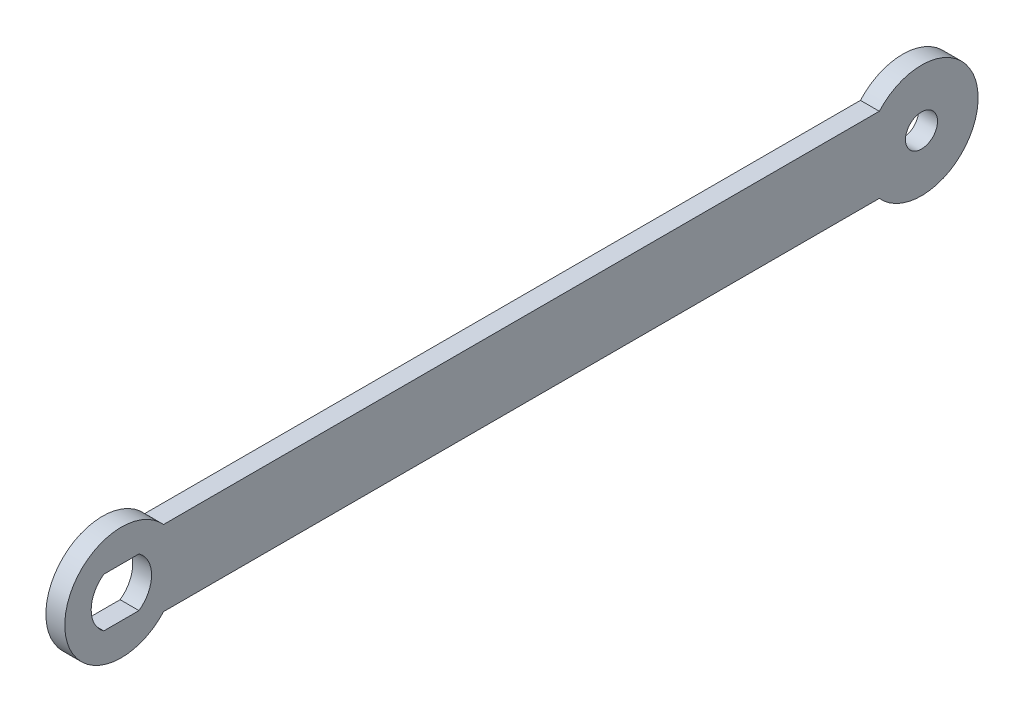
ISO-10303-21;
HEADER;
FILE_DESCRIPTION(('STEP AP214'),'2;1');
FILE_NAME('part.step','',(''),(''),'','','');
FILE_SCHEMA(('AUTOMOTIVE_DESIGN { 1 0 10303 214 1 1 1 1 }'));
ENDSEC;
DATA;
#1=APPLICATION_CONTEXT('core data for automotive mechanical design processes');
#2=APPLICATION_PROTOCOL_DEFINITION('international standard','automotive_design',2000,#1);
#3=PRODUCT_CONTEXT('',#1,'mechanical');
#4=PRODUCT('Part','Part','',(#3));
#5=PRODUCT_RELATED_PRODUCT_CATEGORY('part','',(#4));
#6=PRODUCT_DEFINITION_FORMATION('','',#4);
#7=PRODUCT_DEFINITION_CONTEXT('part definition',#1,'design');
#8=PRODUCT_DEFINITION('design','',#6,#7);
#9=PRODUCT_DEFINITION_SHAPE('','',#8);
#10=(LENGTH_UNIT() NAMED_UNIT(*) SI_UNIT(.MILLI.,.METRE.));
#11=(NAMED_UNIT(*) PLANE_ANGLE_UNIT() SI_UNIT($,.RADIAN.));
#12=(NAMED_UNIT(*) SI_UNIT($,.STERADIAN.) SOLID_ANGLE_UNIT());
#13=UNCERTAINTY_MEASURE_WITH_UNIT(LENGTH_MEASURE(1.E-05),#10,'distance_accuracy_value','');
#14=(GEOMETRIC_REPRESENTATION_CONTEXT(3) GLOBAL_UNCERTAINTY_ASSIGNED_CONTEXT((#13)) GLOBAL_UNIT_ASSIGNED_CONTEXT((#10,
#11,#12)) REPRESENTATION_CONTEXT('',''));
#15=CARTESIAN_POINT('',(0.,0.,0.));
#16=DIRECTION('',(0.,0.,1.));
#17=DIRECTION('',(1.,0.,0.));
#18=AXIS2_PLACEMENT_3D('',#15,#16,#17);
#19=CARTESIAN_POINT('',(5.,0.,0.));
#20=DIRECTION('',(1.,0.,0.));
#21=DIRECTION('',(0.,0.,-1.));
#22=AXIS2_PLACEMENT_3D('',#19,#20,#21);
#23=PLANE('',#22);
#24=CARTESIAN_POINT('',(5.,0.,-212.));
#25=DIRECTION('',(1.,0.,0.));
#26=DIRECTION('',(0.,0.,-1.));
#27=AXIS2_PLACEMENT_3D('',#24,#25,#26);
#28=CIRCLE('',#27,4.25);
#29=CARTESIAN_POINT('',(5.,0.,-216.25));
#30=VERTEX_POINT('',#29);
#31=EDGE_CURVE('E227',#30,#30,#28,.T.);
#32=ORIENTED_EDGE('',*,*,#31,.F.);
#33=EDGE_LOOP('',(#32));
#34=FACE_BOUND('',#33,.T.);
#35=CARTESIAN_POINT('',(5.,0.,0.));
#36=DIRECTION('',(1.,0.,0.));
#37=DIRECTION('',(0.,0.,-1.));
#38=AXIS2_PLACEMENT_3D('',#35,#36,#37);
#39=CIRCLE('',#38,15.);
#40=CARTESIAN_POINT('',(5.,10.,-11.1803398874989));
#41=VERTEX_POINT('',#40);
#42=CARTESIAN_POINT('',(5.,-10.,-11.180339887499));
#43=VERTEX_POINT('',#42);
#44=EDGE_CURVE('E139',#41,#43,#39,.T.);
#45=ORIENTED_EDGE('',*,*,#44,.T.);
#46=DIRECTION('',(0.,0.,-1.));
#47=VECTOR('',#46,1.);
#48=CARTESIAN_POINT('',(5.,-10.,-11.180339887499));
#49=LINE('',#48,#47);
#50=CARTESIAN_POINT('',(5.,-9.99999999999999,-200.819660112501));
#51=VERTEX_POINT('',#50);
#52=EDGE_CURVE('E142',#43,#51,#49,.T.);
#53=ORIENTED_EDGE('',*,*,#52,.T.);
#54=CARTESIAN_POINT('',(5.,0.,-212.));
#55=DIRECTION('',(1.,0.,0.));
#56=DIRECTION('',(0.,0.,-1.));
#57=AXIS2_PLACEMENT_3D('',#54,#55,#56);
#58=CIRCLE('',#57,15.);
#59=CARTESIAN_POINT('',(5.,10.,-200.819660112501));
#60=VERTEX_POINT('',#59);
#61=EDGE_CURVE('E145',#51,#60,#58,.T.);
#62=ORIENTED_EDGE('',*,*,#61,.T.);
#63=DIRECTION('',(0.,0.,1.));
#64=VECTOR('',#63,1.);
#65=CARTESIAN_POINT('',(5.,10.,-11.1803398874989));
#66=LINE('',#65,#64);
#67=EDGE_CURVE('E147',#60,#41,#66,.T.);
#68=ORIENTED_EDGE('',*,*,#67,.T.);
#69=EDGE_LOOP('',(#45,#53,#62,#68));
#70=FACE_BOUND('',#69,.T.);
#71=DIRECTION('',(0.,0.,1.));
#72=VECTOR('',#71,1.);
#73=CARTESIAN_POINT('',(5.,6.5,4.66368952654441));
#74=LINE('',#73,#72);
#75=CARTESIAN_POINT('',(5.,6.5,-4.66368952654441));
#76=VERTEX_POINT('',#75);
#77=CARTESIAN_POINT('',(5.,6.5,4.66368952654441));
#78=VERTEX_POINT('',#77);
#79=EDGE_CURVE('E109',#76,#78,#74,.T.);
#80=ORIENTED_EDGE('',*,*,#79,.F.);
#81=CARTESIAN_POINT('',(5.,0.,0.));
#82=DIRECTION('',(1.,0.,0.));
#83=DIRECTION('',(0.,0.,-1.));
#84=AXIS2_PLACEMENT_3D('',#81,#82,#83);
#85=CIRCLE('',#84,8.);
#86=CARTESIAN_POINT('',(5.,-6.5,-4.66368952654441));
#87=VERTEX_POINT('',#86);
#88=EDGE_CURVE('E101',#87,#76,#85,.T.);
#89=ORIENTED_EDGE('',*,*,#88,.F.);
#90=DIRECTION('',(0.,0.,-1.));
#91=VECTOR('',#90,1.);
#92=CARTESIAN_POINT('',(5.,-6.5,4.66368952654441));
#93=LINE('',#92,#91);
#94=CARTESIAN_POINT('',(5.,-6.5,4.66368952654441));
#95=VERTEX_POINT('',#94);
#96=EDGE_CURVE('E123',#95,#87,#93,.T.);
#97=ORIENTED_EDGE('',*,*,#96,.F.);
#98=CARTESIAN_POINT('',(5.,0.,0.));
#99=DIRECTION('',(1.,0.,0.));
#100=DIRECTION('',(0.,0.,-1.));
#101=AXIS2_PLACEMENT_3D('',#98,#99,#100);
#102=CIRCLE('',#101,8.);
#103=EDGE_CURVE('E121',#78,#95,#102,.T.);
#104=ORIENTED_EDGE('',*,*,#103,.F.);
#105=EDGE_LOOP('',(#80,#89,#97,#104));
#106=FACE_BOUND('',#105,.T.);
#107=ADVANCED_FACE('F36',(#34,#70,#106),#23,.T.);
#108=CARTESIAN_POINT('',(0.,0.,0.));
#109=DIRECTION('',(1.,0.,0.));
#110=DIRECTION('',(0.,0.,-1.));
#111=AXIS2_PLACEMENT_3D('',#108,#109,#110);
#112=PLANE('',#111);
#113=CARTESIAN_POINT('',(0.,0.,-212.));
#114=DIRECTION('',(1.,0.,0.));
#115=DIRECTION('',(0.,0.,-1.));
#116=AXIS2_PLACEMENT_3D('',#113,#114,#115);
#117=CIRCLE('',#116,4.25);
#118=CARTESIAN_POINT('',(0.,0.,-216.25));
#119=VERTEX_POINT('',#118);
#120=EDGE_CURVE('E129',#119,#119,#117,.T.);
#121=ORIENTED_EDGE('',*,*,#120,.T.);
#122=EDGE_LOOP('',(#121));
#123=FACE_BOUND('',#122,.T.);
#124=CARTESIAN_POINT('',(0.,0.,0.));
#125=DIRECTION('',(1.,0.,0.));
#126=DIRECTION('',(0.,0.,-1.));
#127=AXIS2_PLACEMENT_3D('',#124,#125,#126);
#128=CIRCLE('',#127,15.);
#129=CARTESIAN_POINT('',(0.,10.,-11.1803398874989));
#130=VERTEX_POINT('',#129);
#131=CARTESIAN_POINT('',(0.,-10.,-11.180339887499));
#132=VERTEX_POINT('',#131);
#133=EDGE_CURVE('E117',#130,#132,#128,.T.);
#134=ORIENTED_EDGE('',*,*,#133,.F.);
#135=DIRECTION('',(0.,0.,1.));
#136=VECTOR('',#135,1.);
#137=CARTESIAN_POINT('',(0.,10.,-11.1803398874989));
#138=LINE('',#137,#136);
#139=CARTESIAN_POINT('',(0.,10.,-200.819660112501));
#140=VERTEX_POINT('',#139);
#141=EDGE_CURVE('E143',#140,#130,#138,.T.);
#142=ORIENTED_EDGE('',*,*,#141,.F.);
#143=CARTESIAN_POINT('',(0.,0.,-212.));
#144=DIRECTION('',(1.,0.,0.));
#145=DIRECTION('',(0.,0.,-1.));
#146=AXIS2_PLACEMENT_3D('',#143,#144,#145);
#147=CIRCLE('',#146,15.);
#148=CARTESIAN_POINT('',(0.,-9.99999999999999,-200.819660112501));
#149=VERTEX_POINT('',#148);
#150=EDGE_CURVE('E154',#149,#140,#147,.T.);
#151=ORIENTED_EDGE('',*,*,#150,.F.);
#152=DIRECTION('',(0.,0.,-1.));
#153=VECTOR('',#152,1.);
#154=CARTESIAN_POINT('',(0.,-10.,-11.180339887499));
#155=LINE('',#154,#153);
#156=EDGE_CURVE('E152',#132,#149,#155,.T.);
#157=ORIENTED_EDGE('',*,*,#156,.F.);
#158=EDGE_LOOP('',(#134,#142,#151,#157));
#159=FACE_BOUND('',#158,.T.);
#160=CARTESIAN_POINT('',(0.,0.,0.));
#161=DIRECTION('',(1.,0.,0.));
#162=DIRECTION('',(0.,0.,-1.));
#163=AXIS2_PLACEMENT_3D('',#160,#161,#162);
#164=CIRCLE('',#163,8.);
#165=CARTESIAN_POINT('',(0.,-6.5,-4.66368952654441));
#166=VERTEX_POINT('',#165);
#167=CARTESIAN_POINT('',(0.,6.5,-4.66368952654441));
#168=VERTEX_POINT('',#167);
#169=EDGE_CURVE('E59',#166,#168,#164,.T.);
#170=ORIENTED_EDGE('',*,*,#169,.T.);
#171=DIRECTION('',(0.,0.,1.));
#172=VECTOR('',#171,1.);
#173=CARTESIAN_POINT('',(0.,6.5,4.66368952654441));
#174=LINE('',#173,#172);
#175=CARTESIAN_POINT('',(0.,6.5,4.66368952654441));
#176=VERTEX_POINT('',#175);
#177=EDGE_CURVE('E116',#168,#176,#174,.T.);
#178=ORIENTED_EDGE('',*,*,#177,.T.);
#179=CARTESIAN_POINT('',(0.,0.,0.));
#180=DIRECTION('',(1.,0.,0.));
#181=DIRECTION('',(0.,0.,-1.));
#182=AXIS2_PLACEMENT_3D('',#179,#180,#181);
#183=CIRCLE('',#182,8.);
#184=CARTESIAN_POINT('',(0.,-6.5,4.66368952654441));
#185=VERTEX_POINT('',#184);
#186=EDGE_CURVE('E131',#176,#185,#183,.T.);
#187=ORIENTED_EDGE('',*,*,#186,.T.);
#188=DIRECTION('',(0.,0.,-1.));
#189=VECTOR('',#188,1.);
#190=CARTESIAN_POINT('',(0.,-6.5,4.66368952654441));
#191=LINE('',#190,#189);
#192=EDGE_CURVE('E110',#185,#166,#191,.T.);
#193=ORIENTED_EDGE('',*,*,#192,.T.);
#194=EDGE_LOOP('',(#170,#178,#187,#193));
#195=FACE_BOUND('',#194,.T.);
#196=ADVANCED_FACE('F172',(#123,#159,#195),#112,.F.);
#197=CARTESIAN_POINT('',(5.,0.,0.));
#198=DIRECTION('',(-1.,0.,0.));
#199=DIRECTION('',(0.,0.,1.));
#200=AXIS2_PLACEMENT_3D('',#197,#198,#199);
#201=CYLINDRICAL_SURFACE('',#200,15.);
#202=ORIENTED_EDGE('',*,*,#133,.T.);
#203=DIRECTION('',(-1.,0.,0.));
#204=VECTOR('',#203,1.);
#205=CARTESIAN_POINT('',(5.,-10.,-11.180339887499));
#206=LINE('',#205,#204);
#207=EDGE_CURVE('E11',#43,#132,#206,.T.);
#208=ORIENTED_EDGE('',*,*,#207,.F.);
#209=ORIENTED_EDGE('',*,*,#44,.F.);
#210=DIRECTION('',(-1.,0.,0.));
#211=VECTOR('',#210,1.);
#212=CARTESIAN_POINT('',(5.,10.,-11.1803398874989));
#213=LINE('',#212,#211);
#214=EDGE_CURVE('E149',#41,#130,#213,.T.);
#215=ORIENTED_EDGE('',*,*,#214,.T.);
#216=EDGE_LOOP('',(#202,#208,#209,#215));
#217=FACE_BOUND('',#216,.T.);
#218=ADVANCED_FACE('F38',(#217),#201,.T.);
#219=CARTESIAN_POINT('',(5.,-10.,-11.180339887499));
#220=DIRECTION('',(0.,1.,0.));
#221=DIRECTION('',(0.,0.,1.));
#222=AXIS2_PLACEMENT_3D('',#219,#220,#221);
#223=PLANE('',#222);
#224=ORIENTED_EDGE('',*,*,#156,.T.);
#225=DIRECTION('',(-1.,0.,0.));
#226=VECTOR('',#225,1.);
#227=CARTESIAN_POINT('',(5.,-9.99999999999999,-200.819660112501));
#228=LINE('',#227,#226);
#229=EDGE_CURVE('E44',#51,#149,#228,.T.);
#230=ORIENTED_EDGE('',*,*,#229,.F.);
#231=ORIENTED_EDGE('',*,*,#52,.F.);
#232=ORIENTED_EDGE('',*,*,#207,.T.);
#233=EDGE_LOOP('',(#224,#230,#231,#232));
#234=FACE_BOUND('',#233,.T.);
#235=ADVANCED_FACE('F182',(#234),#223,.F.);
#236=CARTESIAN_POINT('',(5.,0.,-212.));
#237=DIRECTION('',(-1.,0.,0.));
#238=DIRECTION('',(0.,0.,1.));
#239=AXIS2_PLACEMENT_3D('',#236,#237,#238);
#240=CYLINDRICAL_SURFACE('',#239,15.);
#241=ORIENTED_EDGE('',*,*,#150,.T.);
#242=DIRECTION('',(-1.,0.,0.));
#243=VECTOR('',#242,1.);
#244=CARTESIAN_POINT('',(5.,10.,-200.819660112501));
#245=LINE('',#244,#243);
#246=EDGE_CURVE('E159',#60,#140,#245,.T.);
#247=ORIENTED_EDGE('',*,*,#246,.F.);
#248=ORIENTED_EDGE('',*,*,#61,.F.);
#249=ORIENTED_EDGE('',*,*,#229,.T.);
#250=EDGE_LOOP('',(#241,#247,#248,#249));
#251=FACE_BOUND('',#250,.T.);
#252=ADVANCED_FACE('F166',(#251),#240,.T.);
#253=CARTESIAN_POINT('',(5.,10.,-11.1803398874989));
#254=DIRECTION('',(0.,-1.,0.));
#255=DIRECTION('',(0.,0.,-1.));
#256=AXIS2_PLACEMENT_3D('',#253,#254,#255);
#257=PLANE('',#256);
#258=ORIENTED_EDGE('',*,*,#141,.T.);
#259=ORIENTED_EDGE('',*,*,#214,.F.);
#260=ORIENTED_EDGE('',*,*,#67,.F.);
#261=ORIENTED_EDGE('',*,*,#246,.T.);
#262=EDGE_LOOP('',(#258,#259,#260,#261));
#263=FACE_BOUND('',#262,.T.);
#264=ADVANCED_FACE('F176',(#263),#257,.F.);
#265=CARTESIAN_POINT('',(5.,0.,0.));
#266=DIRECTION('',(-1.,0.,0.));
#267=DIRECTION('',(0.,0.,1.));
#268=AXIS2_PLACEMENT_3D('',#265,#266,#267);
#269=CYLINDRICAL_SURFACE('',#268,8.);
#270=ORIENTED_EDGE('',*,*,#169,.F.);
#271=DIRECTION('',(-1.,0.,0.));
#272=VECTOR('',#271,1.);
#273=CARTESIAN_POINT('',(5.,-6.5,-4.66368952654441));
#274=LINE('',#273,#272);
#275=EDGE_CURVE('E105',#87,#166,#274,.T.);
#276=ORIENTED_EDGE('',*,*,#275,.F.);
#277=ORIENTED_EDGE('',*,*,#88,.T.);
#278=DIRECTION('',(-1.,0.,0.));
#279=VECTOR('',#278,1.);
#280=CARTESIAN_POINT('',(5.,6.5,-4.66368952654441));
#281=LINE('',#280,#279);
#282=EDGE_CURVE('E104',#76,#168,#281,.T.);
#283=ORIENTED_EDGE('',*,*,#282,.T.);
#284=EDGE_LOOP('',(#270,#276,#277,#283));
#285=FACE_BOUND('',#284,.T.);
#286=ADVANCED_FACE('F103',(#285),#269,.F.);
#287=CARTESIAN_POINT('',(5.,6.5,4.66368952654441));
#288=DIRECTION('',(0.,-1.,0.));
#289=DIRECTION('',(0.,0.,-1.));
#290=AXIS2_PLACEMENT_3D('',#287,#288,#289);
#291=PLANE('',#290);
#292=ORIENTED_EDGE('',*,*,#177,.F.);
#293=ORIENTED_EDGE('',*,*,#282,.F.);
#294=ORIENTED_EDGE('',*,*,#79,.T.);
#295=DIRECTION('',(-1.,0.,0.));
#296=VECTOR('',#295,1.);
#297=CARTESIAN_POINT('',(5.,6.5,4.66368952654441));
#298=LINE('',#297,#296);
#299=EDGE_CURVE('E118',#78,#176,#298,.T.);
#300=ORIENTED_EDGE('',*,*,#299,.T.);
#301=EDGE_LOOP('',(#292,#293,#294,#300));
#302=FACE_BOUND('',#301,.T.);
#303=ADVANCED_FACE('F113',(#302),#291,.T.);
#304=CARTESIAN_POINT('',(5.,0.,0.));
#305=DIRECTION('',(-1.,0.,0.));
#306=DIRECTION('',(0.,0.,1.));
#307=AXIS2_PLACEMENT_3D('',#304,#305,#306);
#308=CYLINDRICAL_SURFACE('',#307,8.);
#309=ORIENTED_EDGE('',*,*,#186,.F.);
#310=ORIENTED_EDGE('',*,*,#299,.F.);
#311=ORIENTED_EDGE('',*,*,#103,.T.);
#312=DIRECTION('',(-1.,0.,0.));
#313=VECTOR('',#312,1.);
#314=CARTESIAN_POINT('',(5.,-6.5,4.66368952654441));
#315=LINE('',#314,#313);
#316=EDGE_CURVE('E51',#95,#185,#315,.T.);
#317=ORIENTED_EDGE('',*,*,#316,.T.);
#318=EDGE_LOOP('',(#309,#310,#311,#317));
#319=FACE_BOUND('',#318,.T.);
#320=ADVANCED_FACE('F208',(#319),#308,.F.);
#321=CARTESIAN_POINT('',(5.,-6.5,4.66368952654441));
#322=DIRECTION('',(0.,1.,0.));
#323=DIRECTION('',(0.,0.,1.));
#324=AXIS2_PLACEMENT_3D('',#321,#322,#323);
#325=PLANE('',#324);
#326=ORIENTED_EDGE('',*,*,#192,.F.);
#327=ORIENTED_EDGE('',*,*,#316,.F.);
#328=ORIENTED_EDGE('',*,*,#96,.T.);
#329=ORIENTED_EDGE('',*,*,#275,.T.);
#330=EDGE_LOOP('',(#326,#327,#328,#329));
#331=FACE_BOUND('',#330,.T.);
#332=ADVANCED_FACE('F212',(#331),#325,.T.);
#333=CARTESIAN_POINT('',(5.,0.,-212.));
#334=DIRECTION('',(1.,0.,0.));
#335=DIRECTION('',(0.,0.,-1.));
#336=AXIS2_PLACEMENT_3D('',#333,#334,#335);
#337=CYLINDRICAL_SURFACE('',#336,4.25);
#338=ORIENTED_EDGE('',*,*,#120,.F.);
#339=EDGE_LOOP('',(#338));
#340=FACE_BOUND('',#339,.T.);
#341=ORIENTED_EDGE('',*,*,#31,.T.);
#342=EDGE_LOOP('',(#341));
#343=FACE_BOUND('',#342,.T.);
#344=ADVANCED_FACE('F218',(#340,#343),#337,.F.);
#345=CLOSED_SHELL('',(#107,#196,#218,#235,#252,#264,#286,#303,#320,#332,#344));
#346=MANIFOLD_SOLID_BREP('B2',#345);
#347=ADVANCED_BREP_SHAPE_REPRESENTATION('',(#18,#346),#14);
#348=SHAPE_DEFINITION_REPRESENTATION(#9,#347);
ENDSEC;
END-ISO-10303-21;
